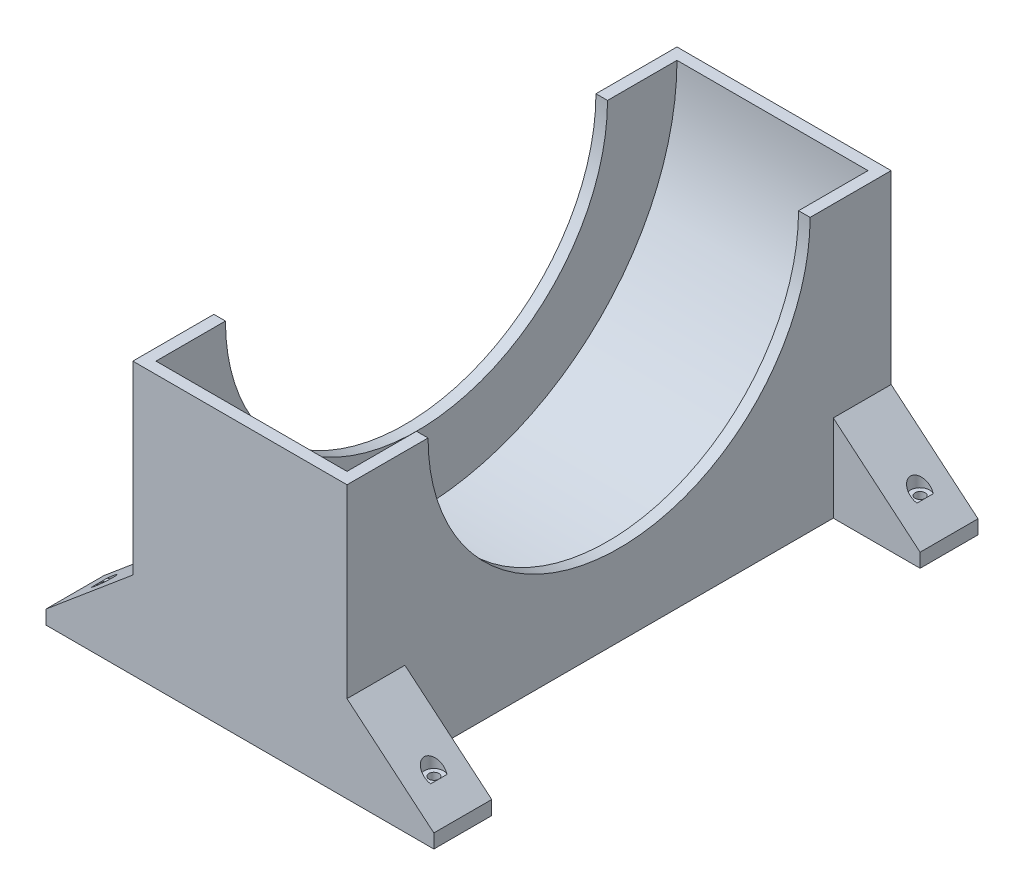
ISO-10303-21;
HEADER;
FILE_DESCRIPTION(('STEP AP214'),'2;1');
FILE_NAME('part.step','',(''),(''),'','','');
FILE_SCHEMA(('AUTOMOTIVE_DESIGN { 1 0 10303 214 1 1 1 1 }'));
ENDSEC;
DATA;
#1=APPLICATION_CONTEXT('core data for automotive mechanical design processes');
#2=APPLICATION_PROTOCOL_DEFINITION('international standard','automotive_design',2000,#1);
#3=PRODUCT_CONTEXT('',#1,'mechanical');
#4=PRODUCT('Part','Part','',(#3));
#5=PRODUCT_RELATED_PRODUCT_CATEGORY('part','',(#4));
#6=PRODUCT_DEFINITION_FORMATION('','',#4);
#7=PRODUCT_DEFINITION_CONTEXT('part definition',#1,'design');
#8=PRODUCT_DEFINITION('design','',#6,#7);
#9=PRODUCT_DEFINITION_SHAPE('','',#8);
#10=(LENGTH_UNIT() NAMED_UNIT(*) SI_UNIT(.MILLI.,.METRE.));
#11=(NAMED_UNIT(*) PLANE_ANGLE_UNIT() SI_UNIT($,.RADIAN.));
#12=(NAMED_UNIT(*) SI_UNIT($,.STERADIAN.) SOLID_ANGLE_UNIT());
#13=UNCERTAINTY_MEASURE_WITH_UNIT(LENGTH_MEASURE(1.E-05),#10,'distance_accuracy_value','');
#14=(GEOMETRIC_REPRESENTATION_CONTEXT(3) GLOBAL_UNCERTAINTY_ASSIGNED_CONTEXT((#13)) GLOBAL_UNIT_ASSIGNED_CONTEXT((#10,
#11,#12)) REPRESENTATION_CONTEXT('',''));
#15=CARTESIAN_POINT('',(0.,0.,0.));
#16=DIRECTION('',(0.,0.,1.));
#17=DIRECTION('',(1.,0.,0.));
#18=AXIS2_PLACEMENT_3D('',#15,#16,#17);
#19=CARTESIAN_POINT('',(119.38,0.,-106.68));
#20=DIRECTION('',(0.,-1.,0.));
#21=DIRECTION('',(0.,0.,-1.));
#22=AXIS2_PLACEMENT_3D('',#19,#20,#21);
#23=CYLINDRICAL_SURFACE('',#22,2.1828125);
#24=CARTESIAN_POINT('',(119.38,-119.38,-106.68));
#25=DIRECTION('',(0.,1.,0.));
#26=DIRECTION('',(0.,0.,1.));
#27=AXIS2_PLACEMENT_3D('',#24,#25,#26);
#28=CIRCLE('',#27,2.1828125);
#29=CARTESIAN_POINT('',(119.38,-119.38,-104.4971875));
#30=VERTEX_POINT('',#29);
#31=EDGE_CURVE('E265',#30,#30,#28,.T.);
#32=ORIENTED_EDGE('',*,*,#31,.F.);
#33=EDGE_LOOP('',(#32));
#34=FACE_BOUND('',#33,.T.);
#35=CARTESIAN_POINT('',(119.38,-104.424734,-106.68));
#36=DIRECTION('',(0.,1.,0.));
#37=DIRECTION('',(0.,0.,1.));
#38=AXIS2_PLACEMENT_3D('',#35,#36,#37);
#39=CIRCLE('',#38,2.1828125);
#40=CARTESIAN_POINT('',(121.5628125,-104.424730897791,-106.68));
#41=VERTEX_POINT('',#40);
#42=EDGE_CURVE('E451',#41,#41,#39,.T.);
#43=ORIENTED_EDGE('',*,*,#42,.T.);
#44=EDGE_LOOP('',(#43));
#45=FACE_BOUND('',#44,.T.);
#46=ADVANCED_FACE('F51',(#34,#45),#23,.F.);
#47=CARTESIAN_POINT('',(119.38,0.,106.68));
#48=DIRECTION('',(0.,-1.,0.));
#49=DIRECTION('',(0.,0.,-1.));
#50=AXIS2_PLACEMENT_3D('',#47,#48,#49);
#51=CYLINDRICAL_SURFACE('',#50,2.1828125);
#52=CARTESIAN_POINT('',(119.38,-119.38,106.68));
#53=DIRECTION('',(0.,1.,0.));
#54=DIRECTION('',(0.,0.,1.));
#55=AXIS2_PLACEMENT_3D('',#52,#53,#54);
#56=CIRCLE('',#55,2.1828125);
#57=CARTESIAN_POINT('',(119.38,-119.38,108.8628125));
#58=VERTEX_POINT('',#57);
#59=EDGE_CURVE('E269',#58,#58,#56,.F.);
#60=ORIENTED_EDGE('',*,*,#59,.T.);
#61=EDGE_LOOP('',(#60));
#62=FACE_BOUND('',#61,.T.);
#63=CARTESIAN_POINT('',(119.38,-104.424734,106.68));
#64=DIRECTION('',(0.,1.,0.));
#65=DIRECTION('',(0.,0.,1.));
#66=AXIS2_PLACEMENT_3D('',#63,#64,#65);
#67=CIRCLE('',#66,2.1828125);
#68=CARTESIAN_POINT('',(121.5628125,-104.424730897791,106.68));
#69=VERTEX_POINT('',#68);
#70=EDGE_CURVE('E449',#69,#69,#67,.F.);
#71=ORIENTED_EDGE('',*,*,#70,.F.);
#72=EDGE_LOOP('',(#71));
#73=FACE_BOUND('',#72,.T.);
#74=ADVANCED_FACE('F472',(#62,#73),#51,.F.);
#75=CARTESIAN_POINT('',(-25.4,0.,-106.68));
#76=DIRECTION('',(0.,-1.,0.));
#77=DIRECTION('',(0.,0.,-1.));
#78=AXIS2_PLACEMENT_3D('',#75,#76,#77);
#79=CYLINDRICAL_SURFACE('',#78,2.18281250000001);
#80=CARTESIAN_POINT('',(-25.4,-119.38,-106.68));
#81=DIRECTION('',(0.,1.,0.));
#82=DIRECTION('',(0.,0.,1.));
#83=AXIS2_PLACEMENT_3D('',#80,#81,#82);
#84=CIRCLE('',#83,2.18281250000001);
#85=CARTESIAN_POINT('',(-25.4,-119.38,-104.4971875));
#86=VERTEX_POINT('',#85);
#87=EDGE_CURVE('E268',#86,#86,#84,.F.);
#88=ORIENTED_EDGE('',*,*,#87,.T.);
#89=EDGE_LOOP('',(#88));
#90=FACE_BOUND('',#89,.T.);
#91=CARTESIAN_POINT('',(-25.4,-104.424734,-106.68));
#92=DIRECTION('',(0.,1.,0.));
#93=DIRECTION('',(0.,0.,1.));
#94=AXIS2_PLACEMENT_3D('',#91,#92,#93);
#95=CIRCLE('',#94,2.18281250000001);
#96=CARTESIAN_POINT('',(-27.5828125,-104.424730897791,-106.68));
#97=VERTEX_POINT('',#96);
#98=EDGE_CURVE('E447',#97,#97,#95,.F.);
#99=ORIENTED_EDGE('',*,*,#98,.F.);
#100=EDGE_LOOP('',(#99));
#101=FACE_BOUND('',#100,.T.);
#102=ADVANCED_FACE('F469',(#90,#101),#79,.F.);
#103=CARTESIAN_POINT('',(-25.4,0.,106.68));
#104=DIRECTION('',(0.,-1.,0.));
#105=DIRECTION('',(0.,0.,-1.));
#106=AXIS2_PLACEMENT_3D('',#103,#104,#105);
#107=CYLINDRICAL_SURFACE('',#106,2.18281250000001);
#108=CARTESIAN_POINT('',(-25.4,-119.38,106.68));
#109=DIRECTION('',(0.,1.,0.));
#110=DIRECTION('',(0.,0.,1.));
#111=AXIS2_PLACEMENT_3D('',#108,#109,#110);
#112=CIRCLE('',#111,2.18281250000001);
#113=CARTESIAN_POINT('',(-25.4,-119.38,108.8628125));
#114=VERTEX_POINT('',#113);
#115=EDGE_CURVE('E272',#114,#114,#112,.T.);
#116=ORIENTED_EDGE('',*,*,#115,.F.);
#117=EDGE_LOOP('',(#116));
#118=FACE_BOUND('',#117,.T.);
#119=CARTESIAN_POINT('',(-25.4,-104.424734,106.68));
#120=DIRECTION('',(0.,1.,0.));
#121=DIRECTION('',(0.,0.,1.));
#122=AXIS2_PLACEMENT_3D('',#119,#120,#121);
#123=CIRCLE('',#122,2.18281250000001);
#124=CARTESIAN_POINT('',(-27.5828125,-104.424730897791,106.68));
#125=VERTEX_POINT('',#124);
#126=EDGE_CURVE('E239',#125,#125,#123,.T.);
#127=ORIENTED_EDGE('',*,*,#126,.T.);
#128=EDGE_LOOP('',(#127));
#129=FACE_BOUND('',#128,.T.);
#130=ADVANCED_FACE('F471',(#118,#129),#107,.F.);
#131=CARTESIAN_POINT('',(93.98,-119.38,119.38));
#132=DIRECTION('',(0.,1.,0.));
#133=DIRECTION('',(0.,0.,1.));
#134=AXIS2_PLACEMENT_3D('',#131,#132,#133);
#135=PLANE('',#134);
#136=ORIENTED_EDGE('',*,*,#87,.F.);
#137=EDGE_LOOP('',(#136));
#138=FACE_BOUND('',#137,.T.);
#139=ORIENTED_EDGE('',*,*,#31,.T.);
#140=EDGE_LOOP('',(#139));
#141=FACE_BOUND('',#140,.T.);
#142=ORIENTED_EDGE('',*,*,#115,.T.);
#143=EDGE_LOOP('',(#142));
#144=FACE_BOUND('',#143,.T.);
#145=ORIENTED_EDGE('',*,*,#59,.F.);
#146=EDGE_LOOP('',(#145));
#147=FACE_BOUND('',#146,.T.);
#148=DIRECTION('',(-1.,0.,0.));
#149=VECTOR('',#148,1.);
#150=CARTESIAN_POINT('',(93.98,-119.38,119.38));
#151=LINE('',#150,#149);
#152=CARTESIAN_POINT('',(132.08,-119.38,119.38));
#153=VERTEX_POINT('',#152);
#154=CARTESIAN_POINT('',(-38.1,-119.38,119.38));
#155=VERTEX_POINT('',#154);
#156=EDGE_CURVE('E360',#153,#155,#151,.T.);
#157=ORIENTED_EDGE('',*,*,#156,.T.);
#158=DIRECTION('',(0.,0.,1.));
#159=VECTOR('',#158,1.);
#160=CARTESIAN_POINT('',(-38.1,-119.38,119.38));
#161=LINE('',#160,#159);
#162=CARTESIAN_POINT('',(-38.1,-119.38,93.98));
#163=VERTEX_POINT('',#162);
#164=EDGE_CURVE('E332',#163,#155,#161,.T.);
#165=ORIENTED_EDGE('',*,*,#164,.F.);
#166=DIRECTION('',(1.,0.,0.));
#167=VECTOR('',#166,1.);
#168=CARTESIAN_POINT('',(-38.1,-119.38,93.98));
#169=LINE('',#168,#167);
#170=CARTESIAN_POINT('',(0.,-119.38,93.98));
#171=VERTEX_POINT('',#170);
#172=EDGE_CURVE('E296',#163,#171,#169,.T.);
#173=ORIENTED_EDGE('',*,*,#172,.T.);
#174=DIRECTION('',(0.,0.,-1.));
#175=VECTOR('',#174,1.);
#176=CARTESIAN_POINT('',(0.,-119.38,119.38));
#177=LINE('',#176,#175);
#178=CARTESIAN_POINT('',(0.,-119.38,-93.9799999999999));
#179=VERTEX_POINT('',#178);
#180=EDGE_CURVE('E357',#171,#179,#177,.T.);
#181=ORIENTED_EDGE('',*,*,#180,.T.);
#182=DIRECTION('',(1.,0.,0.));
#183=VECTOR('',#182,1.);
#184=CARTESIAN_POINT('',(-38.1,-119.38,-93.98));
#185=LINE('',#184,#183);
#186=CARTESIAN_POINT('',(-38.1,-119.38,-93.98));
#187=VERTEX_POINT('',#186);
#188=EDGE_CURVE('E320',#187,#179,#185,.T.);
#189=ORIENTED_EDGE('',*,*,#188,.F.);
#190=DIRECTION('',(0.,0.,1.));
#191=VECTOR('',#190,1.);
#192=CARTESIAN_POINT('',(-38.1,-119.38,-119.38));
#193=LINE('',#192,#191);
#194=CARTESIAN_POINT('',(-38.1,-119.38,-119.38));
#195=VERTEX_POINT('',#194);
#196=EDGE_CURVE('E314',#195,#187,#193,.T.);
#197=ORIENTED_EDGE('',*,*,#196,.F.);
#198=DIRECTION('',(-1.,0.,0.));
#199=VECTOR('',#198,1.);
#200=CARTESIAN_POINT('',(93.98,-119.38,-119.38));
#201=LINE('',#200,#199);
#202=CARTESIAN_POINT('',(132.08,-119.38,-119.38));
#203=VERTEX_POINT('',#202);
#204=EDGE_CURVE('E348',#203,#195,#201,.T.);
#205=ORIENTED_EDGE('',*,*,#204,.F.);
#206=DIRECTION('',(0.,0.,1.));
#207=VECTOR('',#206,1.);
#208=CARTESIAN_POINT('',(132.08,-119.38,-119.38));
#209=LINE('',#208,#207);
#210=CARTESIAN_POINT('',(132.08,-119.38,-93.98));
#211=VERTEX_POINT('',#210);
#212=EDGE_CURVE('E285',#203,#211,#209,.T.);
#213=ORIENTED_EDGE('',*,*,#212,.T.);
#214=DIRECTION('',(-1.,0.,0.));
#215=VECTOR('',#214,1.);
#216=CARTESIAN_POINT('',(132.08,-119.38,-93.98));
#217=LINE('',#216,#215);
#218=CARTESIAN_POINT('',(93.98,-119.38,-93.98));
#219=VERTEX_POINT('',#218);
#220=EDGE_CURVE('E288',#211,#219,#217,.T.);
#221=ORIENTED_EDGE('',*,*,#220,.T.);
#222=DIRECTION('',(0.,0.,-1.));
#223=VECTOR('',#222,1.);
#224=CARTESIAN_POINT('',(93.98,-119.38,119.38));
#225=LINE('',#224,#223);
#226=CARTESIAN_POINT('',(93.98,-119.38,93.98));
#227=VERTEX_POINT('',#226);
#228=EDGE_CURVE('E356',#227,#219,#225,.T.);
#229=ORIENTED_EDGE('',*,*,#228,.F.);
#230=DIRECTION('',(-1.,0.,0.));
#231=VECTOR('',#230,1.);
#232=CARTESIAN_POINT('',(132.08,-119.38,93.98));
#233=LINE('',#232,#231);
#234=CARTESIAN_POINT('',(132.08,-119.38,93.98));
#235=VERTEX_POINT('',#234);
#236=EDGE_CURVE('E292',#235,#227,#233,.T.);
#237=ORIENTED_EDGE('',*,*,#236,.F.);
#238=DIRECTION('',(0.,0.,1.));
#239=VECTOR('',#238,1.);
#240=CARTESIAN_POINT('',(132.08,-119.38,119.38));
#241=LINE('',#240,#239);
#242=EDGE_CURVE('E300',#235,#153,#241,.T.);
#243=ORIENTED_EDGE('',*,*,#242,.T.);
#244=EDGE_LOOP('',(#157,#165,#173,#181,#189,#197,#205,#213,#221,#229,#237,#243));
#245=FACE_BOUND('',#244,.T.);
#246=ADVANCED_FACE('F479',(#138,#141,#144,#147,#245),#135,.F.);
#247=CARTESIAN_POINT('',(93.98,0.,0.));
#248=DIRECTION('',(1.,0.,0.));
#249=DIRECTION('',(0.,0.,-1.));
#250=AXIS2_PLACEMENT_3D('',#247,#248,#249);
#251=PLANE('',#250);
#252=ORIENTED_EDGE('',*,*,#228,.T.);
#253=DIRECTION('',(0.,1.,0.));
#254=VECTOR('',#253,1.);
#255=CARTESIAN_POINT('',(93.98,-119.38,-93.98));
#256=LINE('',#255,#254);
#257=CARTESIAN_POINT('',(93.98,-81.28,-93.98));
#258=VERTEX_POINT('',#257);
#259=EDGE_CURVE('E282',#219,#258,#256,.T.);
#260=ORIENTED_EDGE('',*,*,#259,.T.);
#261=DIRECTION('',(0.,0.,-1.));
#262=VECTOR('',#261,1.);
#263=CARTESIAN_POINT('',(93.98,-81.28,-119.38));
#264=LINE('',#263,#262);
#265=CARTESIAN_POINT('',(93.98,-81.28,-119.38));
#266=VERTEX_POINT('',#265);
#267=EDGE_CURVE('E289',#258,#266,#264,.T.);
#268=ORIENTED_EDGE('',*,*,#267,.T.);
#269=DIRECTION('',(0.,-1.,0.));
#270=VECTOR('',#269,1.);
#271=CARTESIAN_POINT('',(93.98,0.,-119.38));
#272=LINE('',#271,#270);
#273=CARTESIAN_POINT('',(93.98,0.,-119.38));
#274=VERTEX_POINT('',#273);
#275=EDGE_CURVE('E345',#274,#266,#272,.T.);
#276=ORIENTED_EDGE('',*,*,#275,.F.);
#277=DIRECTION('',(0.,0.,1.));
#278=VECTOR('',#277,1.);
#279=CARTESIAN_POINT('',(93.98,0.,-83.82));
#280=LINE('',#279,#278);
#281=CARTESIAN_POINT('',(93.98,0.,-83.82));
#282=VERTEX_POINT('',#281);
#283=EDGE_CURVE('E393',#274,#282,#280,.T.);
#284=ORIENTED_EDGE('',*,*,#283,.T.);
#285=CARTESIAN_POINT('',(93.98,0.,0.));
#286=DIRECTION('',(-1.,0.,0.));
#287=DIRECTION('',(0.,0.,-1.));
#288=AXIS2_PLACEMENT_3D('',#285,#286,#287);
#289=CIRCLE('',#288,83.82);
#290=CARTESIAN_POINT('',(93.98,0.,83.82));
#291=VERTEX_POINT('',#290);
#292=EDGE_CURVE('E395',#282,#291,#289,.T.);
#293=ORIENTED_EDGE('',*,*,#292,.T.);
#294=DIRECTION('',(0.,0.,1.));
#295=VECTOR('',#294,1.);
#296=CARTESIAN_POINT('',(93.98,0.,119.38));
#297=LINE('',#296,#295);
#298=CARTESIAN_POINT('',(93.98,0.,119.38));
#299=VERTEX_POINT('',#298);
#300=EDGE_CURVE('E398',#291,#299,#297,.T.);
#301=ORIENTED_EDGE('',*,*,#300,.T.);
#302=DIRECTION('',(0.,-1.,0.));
#303=VECTOR('',#302,1.);
#304=CARTESIAN_POINT('',(93.98,0.,119.38));
#305=LINE('',#304,#303);
#306=CARTESIAN_POINT('',(93.98,-81.28,119.38));
#307=VERTEX_POINT('',#306);
#308=EDGE_CURVE('E353',#299,#307,#305,.T.);
#309=ORIENTED_EDGE('',*,*,#308,.T.);
#310=DIRECTION('',(0.,0.,-1.));
#311=VECTOR('',#310,1.);
#312=CARTESIAN_POINT('',(93.98,-81.28,119.38));
#313=LINE('',#312,#311);
#314=CARTESIAN_POINT('',(93.98,-81.28,93.98));
#315=VERTEX_POINT('',#314);
#316=EDGE_CURVE('E301',#307,#315,#313,.T.);
#317=ORIENTED_EDGE('',*,*,#316,.T.);
#318=DIRECTION('',(0.,-1.,0.));
#319=VECTOR('',#318,1.);
#320=CARTESIAN_POINT('',(93.98,-119.38,93.98));
#321=LINE('',#320,#319);
#322=EDGE_CURVE('E277',#315,#227,#321,.T.);
#323=ORIENTED_EDGE('',*,*,#322,.T.);
#324=EDGE_LOOP('',(#252,#260,#268,#276,#284,#293,#301,#309,#317,#323));
#325=FACE_BOUND('',#324,.T.);
#326=ADVANCED_FACE('F545',(#325),#251,.T.);
#327=CARTESIAN_POINT('',(0.,0.,0.));
#328=DIRECTION('',(1.,0.,0.));
#329=DIRECTION('',(0.,0.,-1.));
#330=AXIS2_PLACEMENT_3D('',#327,#328,#329);
#331=PLANE('',#330);
#332=DIRECTION('',(0.,0.,-1.));
#333=VECTOR('',#332,1.);
#334=CARTESIAN_POINT('',(0.,-81.28,-119.38));
#335=LINE('',#334,#333);
#336=CARTESIAN_POINT('',(0.,-81.28,-93.98));
#337=VERTEX_POINT('',#336);
#338=CARTESIAN_POINT('',(0.,-81.28,-119.38));
#339=VERTEX_POINT('',#338);
#340=EDGE_CURVE('E315',#337,#339,#335,.T.);
#341=ORIENTED_EDGE('',*,*,#340,.F.);
#342=DIRECTION('',(0.,1.,0.));
#343=VECTOR('',#342,1.);
#344=CARTESIAN_POINT('',(0.,-119.38,-93.98));
#345=LINE('',#344,#343);
#346=EDGE_CURVE('E321',#179,#337,#345,.T.);
#347=ORIENTED_EDGE('',*,*,#346,.F.);
#348=ORIENTED_EDGE('',*,*,#180,.F.);
#349=DIRECTION('',(0.,-1.,0.));
#350=VECTOR('',#349,1.);
#351=CARTESIAN_POINT('',(0.,-119.38,93.98));
#352=LINE('',#351,#350);
#353=CARTESIAN_POINT('',(0.,-81.28,93.98));
#354=VERTEX_POINT('',#353);
#355=EDGE_CURVE('E333',#354,#171,#352,.T.);
#356=ORIENTED_EDGE('',*,*,#355,.F.);
#357=DIRECTION('',(0.,0.,-1.));
#358=VECTOR('',#357,1.);
#359=CARTESIAN_POINT('',(0.,-81.28,119.38));
#360=LINE('',#359,#358);
#361=CARTESIAN_POINT('',(0.,-81.28,119.38));
#362=VERTEX_POINT('',#361);
#363=EDGE_CURVE('E324',#362,#354,#360,.T.);
#364=ORIENTED_EDGE('',*,*,#363,.F.);
#365=DIRECTION('',(0.,-1.,0.));
#366=VECTOR('',#365,1.);
#367=CARTESIAN_POINT('',(0.,0.,119.38));
#368=LINE('',#367,#366);
#369=CARTESIAN_POINT('',(0.,0.,119.38));
#370=VERTEX_POINT('',#369);
#371=EDGE_CURVE('E352',#370,#362,#368,.T.);
#372=ORIENTED_EDGE('',*,*,#371,.F.);
#373=DIRECTION('',(0.,0.,1.));
#374=VECTOR('',#373,1.);
#375=CARTESIAN_POINT('',(0.,0.,119.38));
#376=LINE('',#375,#374);
#377=CARTESIAN_POINT('',(0.,0.,83.82));
#378=VERTEX_POINT('',#377);
#379=EDGE_CURVE('E396',#378,#370,#376,.T.);
#380=ORIENTED_EDGE('',*,*,#379,.F.);
#381=CARTESIAN_POINT('',(0.,0.,0.));
#382=DIRECTION('',(-1.,0.,0.));
#383=DIRECTION('',(0.,0.,-1.));
#384=AXIS2_PLACEMENT_3D('',#381,#382,#383);
#385=CIRCLE('',#384,83.82);
#386=CARTESIAN_POINT('',(0.,0.,-83.82));
#387=VERTEX_POINT('',#386);
#388=EDGE_CURVE('E403',#387,#378,#385,.T.);
#389=ORIENTED_EDGE('',*,*,#388,.F.);
#390=DIRECTION('',(0.,0.,1.));
#391=VECTOR('',#390,1.);
#392=CARTESIAN_POINT('',(0.,0.,-83.82));
#393=LINE('',#392,#391);
#394=CARTESIAN_POINT('',(0.,0.,-119.38));
#395=VERTEX_POINT('',#394);
#396=EDGE_CURVE('E377',#395,#387,#393,.T.);
#397=ORIENTED_EDGE('',*,*,#396,.F.);
#398=DIRECTION('',(0.,-1.,0.));
#399=VECTOR('',#398,1.);
#400=CARTESIAN_POINT('',(0.,0.,-119.38));
#401=LINE('',#400,#399);
#402=EDGE_CURVE('E329',#395,#339,#401,.T.);
#403=ORIENTED_EDGE('',*,*,#402,.T.);
#404=EDGE_LOOP('',(#341,#347,#348,#356,#364,#372,#380,#389,#397,#403));
#405=FACE_BOUND('',#404,.T.);
#406=ADVANCED_FACE('F609',(#405),#331,.F.);
#407=CARTESIAN_POINT('',(93.98,0.,-119.38));
#408=DIRECTION('',(0.,0.,-1.));
#409=DIRECTION('',(-1.,0.,0.));
#410=AXIS2_PLACEMENT_3D('',#407,#408,#409);
#411=PLANE('',#410);
#412=DIRECTION('',(0.,-1.,0.));
#413=VECTOR('',#412,1.);
#414=CARTESIAN_POINT('',(132.08,-119.38,-119.38));
#415=LINE('',#414,#413);
#416=CARTESIAN_POINT('',(132.08,-113.249695947854,-119.38));
#417=VERTEX_POINT('',#416);
#418=EDGE_CURVE('E278',#417,#203,#415,.T.);
#419=ORIENTED_EDGE('',*,*,#418,.T.);
#420=ORIENTED_EDGE('',*,*,#204,.T.);
#421=DIRECTION('',(0.,-1.,0.));
#422=VECTOR('',#421,1.);
#423=CARTESIAN_POINT('',(-38.1,-119.38,-119.38));
#424=LINE('',#423,#422);
#425=CARTESIAN_POINT('',(-38.1,-113.249695947854,-119.38));
#426=VERTEX_POINT('',#425);
#427=EDGE_CURVE('E311',#426,#195,#424,.T.);
#428=ORIENTED_EDGE('',*,*,#427,.F.);
#429=DIRECTION('',(-0.76604444311898,-0.642787609686537,0.));
#430=VECTOR('',#429,1.);
#431=CARTESIAN_POINT('',(95.1723149509855,-1.42094562634073,-119.38));
#432=LINE('',#431,#430);
#433=EDGE_CURVE('E430',#426,#339,#432,.F.);
#434=ORIENTED_EDGE('',*,*,#433,.T.);
#435=ORIENTED_EDGE('',*,*,#402,.F.);
#436=DIRECTION('',(-1.,0.,0.));
#437=VECTOR('',#436,1.);
#438=CARTESIAN_POINT('',(93.98,0.,-119.38));
#439=LINE('',#438,#437);
#440=EDGE_CURVE('E417',#274,#395,#439,.T.);
#441=ORIENTED_EDGE('',*,*,#440,.F.);
#442=ORIENTED_EDGE('',*,*,#275,.T.);
#443=DIRECTION('',(0.766044443118979,-0.642787609686538,0.));
#444=VECTOR('',#443,1.);
#445=CARTESIAN_POINT('',(53.9574129175838,-47.6970619403843,-119.38));
#446=LINE('',#445,#444);
#447=EDGE_CURVE('E440',#266,#417,#446,.T.);
#448=ORIENTED_EDGE('',*,*,#447,.T.);
#449=EDGE_LOOP('',(#419,#420,#428,#434,#435,#441,#442,#448));
#450=FACE_BOUND('',#449,.T.);
#451=ADVANCED_FACE('F557',(#450),#411,.T.);
#452=CARTESIAN_POINT('',(93.98,0.,119.38));
#453=DIRECTION('',(0.,0.,-1.));
#454=DIRECTION('',(-1.,0.,0.));
#455=AXIS2_PLACEMENT_3D('',#452,#453,#454);
#456=PLANE('',#455);
#457=ORIENTED_EDGE('',*,*,#371,.T.);
#458=DIRECTION('',(-0.76604444311898,-0.642787609686537,0.));
#459=VECTOR('',#458,1.);
#460=CARTESIAN_POINT('',(-38.1,-113.249695947854,119.38));
#461=LINE('',#460,#459);
#462=CARTESIAN_POINT('',(-38.1,-113.249695947854,119.38));
#463=VERTEX_POINT('',#462);
#464=EDGE_CURVE('E425',#362,#463,#461,.T.);
#465=ORIENTED_EDGE('',*,*,#464,.T.);
#466=DIRECTION('',(0.,1.,0.));
#467=VECTOR('',#466,1.);
#468=CARTESIAN_POINT('',(-38.1,-119.38,119.38));
#469=LINE('',#468,#467);
#470=EDGE_CURVE('E336',#155,#463,#469,.T.);
#471=ORIENTED_EDGE('',*,*,#470,.F.);
#472=ORIENTED_EDGE('',*,*,#156,.F.);
#473=DIRECTION('',(0.,1.,0.));
#474=VECTOR('',#473,1.);
#475=CARTESIAN_POINT('',(132.08,-119.38,119.38));
#476=LINE('',#475,#474);
#477=CARTESIAN_POINT('',(132.08,-113.249695947854,119.38));
#478=VERTEX_POINT('',#477);
#479=EDGE_CURVE('E297',#153,#478,#476,.T.);
#480=ORIENTED_EDGE('',*,*,#479,.T.);
#481=DIRECTION('',(0.766044443118979,-0.642787609686538,0.));
#482=VECTOR('',#481,1.);
#483=CARTESIAN_POINT('',(93.9799999999999,-81.28,119.38));
#484=LINE('',#483,#482);
#485=EDGE_CURVE('E438',#478,#307,#484,.F.);
#486=ORIENTED_EDGE('',*,*,#485,.T.);
#487=ORIENTED_EDGE('',*,*,#308,.F.);
#488=DIRECTION('',(-1.,0.,0.));
#489=VECTOR('',#488,1.);
#490=CARTESIAN_POINT('',(93.98,0.,119.38));
#491=LINE('',#490,#489);
#492=EDGE_CURVE('E400',#299,#370,#491,.T.);
#493=ORIENTED_EDGE('',*,*,#492,.T.);
#494=EDGE_LOOP('',(#457,#465,#471,#472,#480,#486,#487,#493));
#495=FACE_BOUND('',#494,.T.);
#496=ADVANCED_FACE('F593',(#495),#456,.F.);
#497=CARTESIAN_POINT('',(93.98,0.,-83.82));
#498=DIRECTION('',(0.,-1.,0.));
#499=DIRECTION('',(0.,0.,-1.));
#500=AXIS2_PLACEMENT_3D('',#497,#498,#499);
#501=PLANE('',#500);
#502=DIRECTION('',(0.,0.,1.));
#503=VECTOR('',#502,1.);
#504=CARTESIAN_POINT('',(5.08,0.,-83.82));
#505=LINE('',#504,#503);
#506=CARTESIAN_POINT('',(5.08,0.,-114.3));
#507=VERTEX_POINT('',#506);
#508=CARTESIAN_POINT('',(5.08,0.,-83.82));
#509=VERTEX_POINT('',#508);
#510=EDGE_CURVE('E369',#507,#509,#505,.T.);
#511=ORIENTED_EDGE('',*,*,#510,.F.);
#512=DIRECTION('',(-1.,0.,0.));
#513=VECTOR('',#512,1.);
#514=CARTESIAN_POINT('',(88.9,0.,-114.3));
#515=LINE('',#514,#513);
#516=CARTESIAN_POINT('',(88.9,0.,-114.3));
#517=VERTEX_POINT('',#516);
#518=EDGE_CURVE('E375',#517,#507,#515,.T.);
#519=ORIENTED_EDGE('',*,*,#518,.F.);
#520=DIRECTION('',(0.,0.,1.));
#521=VECTOR('',#520,1.);
#522=CARTESIAN_POINT('',(88.9,0.,-83.82));
#523=LINE('',#522,#521);
#524=CARTESIAN_POINT('',(88.9,0.,-83.82));
#525=VERTEX_POINT('',#524);
#526=EDGE_CURVE('E373',#517,#525,#523,.T.);
#527=ORIENTED_EDGE('',*,*,#526,.T.);
#528=DIRECTION('',(-1.,0.,0.));
#529=VECTOR('',#528,1.);
#530=CARTESIAN_POINT('',(93.98,0.,-83.82));
#531=LINE('',#530,#529);
#532=EDGE_CURVE('E414',#282,#525,#531,.T.);
#533=ORIENTED_EDGE('',*,*,#532,.F.);
#534=ORIENTED_EDGE('',*,*,#283,.F.);
#535=ORIENTED_EDGE('',*,*,#440,.T.);
#536=ORIENTED_EDGE('',*,*,#396,.T.);
#537=EDGE_CURVE('E413',#509,#387,#531,.T.);
#538=ORIENTED_EDGE('',*,*,#537,.F.);
#539=EDGE_LOOP('',(#511,#519,#527,#533,#534,#535,#536,#538));
#540=FACE_BOUND('',#539,.T.);
#541=ADVANCED_FACE('F566',(#540),#501,.F.);
#542=CARTESIAN_POINT('',(93.98,0.,0.));
#543=DIRECTION('',(-1.,0.,0.));
#544=DIRECTION('',(0.,0.,1.));
#545=AXIS2_PLACEMENT_3D('',#542,#543,#544);
#546=CYLINDRICAL_SURFACE('',#545,83.82);
#547=CARTESIAN_POINT('',(5.08,0.,0.));
#548=DIRECTION('',(1.,0.,0.));
#549=DIRECTION('',(0.,0.,-1.));
#550=AXIS2_PLACEMENT_3D('',#547,#548,#549);
#551=CIRCLE('',#550,83.82);
#552=CARTESIAN_POINT('',(5.08,0.,83.82));
#553=VERTEX_POINT('',#552);
#554=EDGE_CURVE('E380',#509,#553,#551,.F.);
#555=ORIENTED_EDGE('',*,*,#554,.F.);
#556=ORIENTED_EDGE('',*,*,#537,.T.);
#557=ORIENTED_EDGE('',*,*,#388,.T.);
#558=DIRECTION('',(-1.,0.,0.));
#559=VECTOR('',#558,1.);
#560=CARTESIAN_POINT('',(93.98,0.,83.82));
#561=LINE('',#560,#559);
#562=EDGE_CURVE('E409',#553,#378,#561,.T.);
#563=ORIENTED_EDGE('',*,*,#562,.F.);
#564=EDGE_LOOP('',(#555,#556,#557,#563));
#565=FACE_BOUND('',#564,.T.);
#566=ADVANCED_FACE('F615',(#565),#546,.F.);
#567=CARTESIAN_POINT('',(93.98,0.,119.38));
#568=DIRECTION('',(0.,-1.,0.));
#569=DIRECTION('',(0.,0.,-1.));
#570=AXIS2_PLACEMENT_3D('',#567,#568,#569);
#571=PLANE('',#570);
#572=DIRECTION('',(0.,0.,1.));
#573=VECTOR('',#572,1.);
#574=CARTESIAN_POINT('',(5.08,0.,119.38));
#575=LINE('',#574,#573);
#576=CARTESIAN_POINT('',(5.08,0.,114.3));
#577=VERTEX_POINT('',#576);
#578=EDGE_CURVE('E374',#553,#577,#575,.T.);
#579=ORIENTED_EDGE('',*,*,#578,.F.);
#580=ORIENTED_EDGE('',*,*,#562,.T.);
#581=ORIENTED_EDGE('',*,*,#379,.T.);
#582=ORIENTED_EDGE('',*,*,#492,.F.);
#583=ORIENTED_EDGE('',*,*,#300,.F.);
#584=CARTESIAN_POINT('',(88.9,0.,83.82));
#585=VERTEX_POINT('',#584);
#586=EDGE_CURVE('E410',#291,#585,#561,.T.);
#587=ORIENTED_EDGE('',*,*,#586,.T.);
#588=DIRECTION('',(0.,0.,1.));
#589=VECTOR('',#588,1.);
#590=CARTESIAN_POINT('',(88.9,0.,119.38));
#591=LINE('',#590,#589);
#592=CARTESIAN_POINT('',(88.9,0.,114.3));
#593=VERTEX_POINT('',#592);
#594=EDGE_CURVE('E385',#585,#593,#591,.T.);
#595=ORIENTED_EDGE('',*,*,#594,.T.);
#596=DIRECTION('',(-1.,0.,0.));
#597=VECTOR('',#596,1.);
#598=CARTESIAN_POINT('',(88.9,0.,114.3));
#599=LINE('',#598,#597);
#600=EDGE_CURVE('E378',#593,#577,#599,.T.);
#601=ORIENTED_EDGE('',*,*,#600,.T.);
#602=EDGE_LOOP('',(#579,#580,#581,#582,#583,#587,#595,#601));
#603=FACE_BOUND('',#602,.T.);
#604=ADVANCED_FACE('F574',(#603),#571,.F.);
#605=ORIENTED_EDGE('',*,*,#532,.T.);
#606=CARTESIAN_POINT('',(88.9,0.,0.));
#607=DIRECTION('',(1.,0.,0.));
#608=DIRECTION('',(0.,0.,-1.));
#609=AXIS2_PLACEMENT_3D('',#606,#607,#608);
#610=CIRCLE('',#609,83.82);
#611=EDGE_CURVE('E388',#525,#585,#610,.F.);
#612=ORIENTED_EDGE('',*,*,#611,.T.);
#613=ORIENTED_EDGE('',*,*,#586,.F.);
#614=ORIENTED_EDGE('',*,*,#292,.F.);
#615=EDGE_LOOP('',(#605,#612,#613,#614));
#616=FACE_BOUND('',#615,.T.);
#617=ADVANCED_FACE('F569',(#616),#546,.F.);
#618=CARTESIAN_POINT('',(93.98,0.,0.));
#619=DIRECTION('',(-1.,0.,0.));
#620=DIRECTION('',(0.,0.,1.));
#621=AXIS2_PLACEMENT_3D('',#618,#619,#620);
#622=CYLINDRICAL_SURFACE('',#621,114.3);
#623=CARTESIAN_POINT('',(5.08,0.,0.));
#624=DIRECTION('',(1.,0.,0.));
#625=DIRECTION('',(0.,0.,-1.));
#626=AXIS2_PLACEMENT_3D('',#623,#624,#625);
#627=CIRCLE('',#626,114.3);
#628=EDGE_CURVE('E366',#577,#507,#627,.T.);
#629=ORIENTED_EDGE('',*,*,#628,.F.);
#630=ORIENTED_EDGE('',*,*,#600,.F.);
#631=CARTESIAN_POINT('',(88.9,0.,0.));
#632=DIRECTION('',(1.,0.,0.));
#633=DIRECTION('',(0.,0.,-1.));
#634=AXIS2_PLACEMENT_3D('',#631,#632,#633);
#635=CIRCLE('',#634,114.3);
#636=EDGE_CURVE('E370',#593,#517,#635,.T.);
#637=ORIENTED_EDGE('',*,*,#636,.T.);
#638=ORIENTED_EDGE('',*,*,#518,.T.);
#639=EDGE_LOOP('',(#629,#630,#637,#638));
#640=FACE_BOUND('',#639,.T.);
#641=ADVANCED_FACE('F622',(#640),#622,.F.);
#642=CARTESIAN_POINT('',(88.9,0.,0.));
#643=DIRECTION('',(1.,0.,0.));
#644=DIRECTION('',(0.,0.,-1.));
#645=AXIS2_PLACEMENT_3D('',#642,#643,#644);
#646=PLANE('',#645);
#647=ORIENTED_EDGE('',*,*,#636,.F.);
#648=ORIENTED_EDGE('',*,*,#594,.F.);
#649=ORIENTED_EDGE('',*,*,#611,.F.);
#650=ORIENTED_EDGE('',*,*,#526,.F.);
#651=EDGE_LOOP('',(#647,#648,#649,#650));
#652=FACE_BOUND('',#651,.T.);
#653=ADVANCED_FACE('F624',(#652),#646,.F.);
#654=CARTESIAN_POINT('',(5.08,0.,0.));
#655=DIRECTION('',(1.,0.,0.));
#656=DIRECTION('',(0.,0.,-1.));
#657=AXIS2_PLACEMENT_3D('',#654,#655,#656);
#658=PLANE('',#657);
#659=ORIENTED_EDGE('',*,*,#628,.T.);
#660=ORIENTED_EDGE('',*,*,#510,.T.);
#661=ORIENTED_EDGE('',*,*,#554,.T.);
#662=ORIENTED_EDGE('',*,*,#578,.T.);
#663=EDGE_LOOP('',(#659,#660,#661,#662));
#664=FACE_BOUND('',#663,.T.);
#665=ADVANCED_FACE('F618',(#664),#658,.T.);
#666=CARTESIAN_POINT('',(-38.1,-119.38,93.98));
#667=DIRECTION('',(0.,0.,1.));
#668=DIRECTION('',(1.,0.,0.));
#669=AXIS2_PLACEMENT_3D('',#666,#667,#668);
#670=PLANE('',#669);
#671=DIRECTION('',(0.,-1.,0.));
#672=VECTOR('',#671,1.);
#673=CARTESIAN_POINT('',(-38.1,-119.38,93.98));
#674=LINE('',#673,#672);
#675=CARTESIAN_POINT('',(-38.1,-113.249695947854,93.98));
#676=VERTEX_POINT('',#675);
#677=EDGE_CURVE('E341',#676,#163,#674,.T.);
#678=ORIENTED_EDGE('',*,*,#677,.F.);
#679=DIRECTION('',(0.76604444311898,0.642787609686537,0.));
#680=VECTOR('',#679,1.);
#681=CARTESIAN_POINT('',(-38.1,-113.249695947854,93.98));
#682=LINE('',#681,#680);
#683=EDGE_CURVE('E423',#676,#354,#682,.T.);
#684=ORIENTED_EDGE('',*,*,#683,.T.);
#685=ORIENTED_EDGE('',*,*,#355,.T.);
#686=ORIENTED_EDGE('',*,*,#172,.F.);
#687=EDGE_LOOP('',(#678,#684,#685,#686));
#688=FACE_BOUND('',#687,.T.);
#689=ADVANCED_FACE('F597',(#688),#670,.F.);
#690=CARTESIAN_POINT('',(-38.1,0.,0.));
#691=DIRECTION('',(-1.,0.,0.));
#692=DIRECTION('',(0.,0.,1.));
#693=AXIS2_PLACEMENT_3D('',#690,#691,#692);
#694=PLANE('',#693);
#695=ORIENTED_EDGE('',*,*,#470,.T.);
#696=DIRECTION('',(0.,0.,-1.));
#697=VECTOR('',#696,1.);
#698=CARTESIAN_POINT('',(-38.1,-113.249695947854,93.98));
#699=LINE('',#698,#697);
#700=EDGE_CURVE('E420',#463,#676,#699,.T.);
#701=ORIENTED_EDGE('',*,*,#700,.T.);
#702=ORIENTED_EDGE('',*,*,#677,.T.);
#703=ORIENTED_EDGE('',*,*,#164,.T.);
#704=EDGE_LOOP('',(#695,#701,#702,#703));
#705=FACE_BOUND('',#704,.T.);
#706=ADVANCED_FACE('F589',(#705),#694,.T.);
#707=CARTESIAN_POINT('',(-38.1,-119.38,-93.98));
#708=DIRECTION('',(0.,0.,-1.));
#709=DIRECTION('',(-1.,0.,0.));
#710=AXIS2_PLACEMENT_3D('',#707,#708,#709);
#711=PLANE('',#710);
#712=ORIENTED_EDGE('',*,*,#346,.T.);
#713=DIRECTION('',(0.76604444311898,0.642787609686537,0.));
#714=VECTOR('',#713,1.);
#715=CARTESIAN_POINT('',(-38.1,-113.249695947854,-93.98));
#716=LINE('',#715,#714);
#717=CARTESIAN_POINT('',(-38.1,-113.249695947854,-93.98));
#718=VERTEX_POINT('',#717);
#719=EDGE_CURVE('E432',#337,#718,#716,.F.);
#720=ORIENTED_EDGE('',*,*,#719,.T.);
#721=DIRECTION('',(0.,1.,0.));
#722=VECTOR('',#721,1.);
#723=CARTESIAN_POINT('',(-38.1,-119.38,-93.98));
#724=LINE('',#723,#722);
#725=EDGE_CURVE('E317',#187,#718,#724,.T.);
#726=ORIENTED_EDGE('',*,*,#725,.F.);
#727=ORIENTED_EDGE('',*,*,#188,.T.);
#728=EDGE_LOOP('',(#712,#720,#726,#727));
#729=FACE_BOUND('',#728,.T.);
#730=ADVANCED_FACE('F604',(#729),#711,.F.);
#731=CARTESIAN_POINT('',(-38.1,0.,0.));
#732=DIRECTION('',(1.,0.,0.));
#733=DIRECTION('',(0.,0.,-1.));
#734=AXIS2_PLACEMENT_3D('',#731,#732,#733);
#735=PLANE('',#734);
#736=ORIENTED_EDGE('',*,*,#725,.T.);
#737=DIRECTION('',(0.,0.,-1.));
#738=VECTOR('',#737,1.);
#739=CARTESIAN_POINT('',(-38.1,-113.249695947854,0.));
#740=LINE('',#739,#738);
#741=EDGE_CURVE('E427',#718,#426,#740,.T.);
#742=ORIENTED_EDGE('',*,*,#741,.T.);
#743=ORIENTED_EDGE('',*,*,#427,.T.);
#744=ORIENTED_EDGE('',*,*,#196,.T.);
#745=EDGE_LOOP('',(#736,#742,#743,#744));
#746=FACE_BOUND('',#745,.T.);
#747=ADVANCED_FACE('F608',(#746),#735,.F.);
#748=CARTESIAN_POINT('',(-38.1,-113.249695947854,0.));
#749=DIRECTION('',(-0.642787609686537,0.76604444311898,0.));
#750=DIRECTION('',(0.,0.,1.));
#751=AXIS2_PLACEMENT_3D('',#748,#749,#750);
#752=PLANE('',#751);
#753=CARTESIAN_POINT('',(-25.4,-102.593130631903,106.68));
#754=DIRECTION('',(-0.642787609686537,0.76604444311898,0.));
#755=DIRECTION('',(0.76604444311898,0.642787609686537,0.));
#756=AXIS2_PLACEMENT_3D('',#753,#754,#755);
#757=ELLIPSE('',#756,5.47096194959157,4.191);
#758=CARTESIAN_POINT('',(-27.5828198941374,-104.424734,110.257677781712));
#759=VERTEX_POINT('',#758);
#760=CARTESIAN_POINT('',(-27.5828198941374,-104.424734,103.102322218288));
#761=VERTEX_POINT('',#760);
#762=EDGE_CURVE('E12',#759,#761,#757,.T.);
#763=ORIENTED_EDGE('',*,*,#762,.F.);
#764=DIRECTION('',(0.,0.,-1.));
#765=VECTOR('',#764,1.);
#766=CARTESIAN_POINT('',(-27.5828198941374,-104.424734,0.));
#767=LINE('',#766,#765);
#768=EDGE_CURVE('E236',#759,#125,#767,.T.);
#769=ORIENTED_EDGE('',*,*,#768,.T.);
#770=EDGE_CURVE('E244',#125,#761,#767,.T.);
#771=ORIENTED_EDGE('',*,*,#770,.T.);
#772=EDGE_LOOP('',(#763,#769,#771));
#773=FACE_BOUND('',#772,.T.);
#774=ORIENTED_EDGE('',*,*,#464,.F.);
#775=ORIENTED_EDGE('',*,*,#363,.T.);
#776=ORIENTED_EDGE('',*,*,#683,.F.);
#777=ORIENTED_EDGE('',*,*,#700,.F.);
#778=EDGE_LOOP('',(#774,#775,#776,#777));
#779=FACE_BOUND('',#778,.T.);
#780=ADVANCED_FACE('F250',(#773,#779),#752,.T.);
#781=CARTESIAN_POINT('',(-38.1,-113.249695947854,0.));
#782=DIRECTION('',(0.642787609686537,-0.76604444311898,0.));
#783=DIRECTION('',(0.,0.,-1.));
#784=AXIS2_PLACEMENT_3D('',#781,#782,#783);
#785=PLANE('',#784);
#786=CARTESIAN_POINT('',(-25.4,-102.593130631903,-106.68));
#787=DIRECTION('',(0.642787609686537,-0.76604444311898,0.));
#788=DIRECTION('',(0.76604444311898,0.642787609686537,0.));
#789=AXIS2_PLACEMENT_3D('',#786,#787,#788);
#790=ELLIPSE('',#789,5.47096194959157,4.191);
#791=CARTESIAN_POINT('',(-27.5828198941374,-104.424734,-103.102322218288));
#792=VERTEX_POINT('',#791);
#793=CARTESIAN_POINT('',(-27.5828198941374,-104.424734,-110.257677781712));
#794=VERTEX_POINT('',#793);
#795=EDGE_CURVE('E60',#792,#794,#790,.F.);
#796=ORIENTED_EDGE('',*,*,#795,.F.);
#797=DIRECTION('',(0.,0.,1.));
#798=VECTOR('',#797,1.);
#799=CARTESIAN_POINT('',(-27.5828198941374,-104.424734,0.));
#800=LINE('',#799,#798);
#801=EDGE_CURVE('E256',#792,#97,#800,.F.);
#802=ORIENTED_EDGE('',*,*,#801,.T.);
#803=EDGE_CURVE('E243',#97,#794,#800,.F.);
#804=ORIENTED_EDGE('',*,*,#803,.T.);
#805=EDGE_LOOP('',(#796,#802,#804));
#806=FACE_BOUND('',#805,.T.);
#807=ORIENTED_EDGE('',*,*,#719,.F.);
#808=ORIENTED_EDGE('',*,*,#340,.T.);
#809=ORIENTED_EDGE('',*,*,#433,.F.);
#810=ORIENTED_EDGE('',*,*,#741,.F.);
#811=EDGE_LOOP('',(#807,#808,#809,#810));
#812=FACE_BOUND('',#811,.T.);
#813=ADVANCED_FACE('F464',(#806,#812),#785,.F.);
#814=CARTESIAN_POINT('',(132.08,-119.38,93.98));
#815=DIRECTION('',(0.,0.,-1.));
#816=DIRECTION('',(-1.,0.,0.));
#817=AXIS2_PLACEMENT_3D('',#814,#815,#816);
#818=PLANE('',#817);
#819=ORIENTED_EDGE('',*,*,#322,.F.);
#820=DIRECTION('',(-0.766044443118979,0.642787609686538,0.));
#821=VECTOR('',#820,1.);
#822=CARTESIAN_POINT('',(135.098585479438,-115.782589910328,93.98));
#823=LINE('',#822,#821);
#824=CARTESIAN_POINT('',(132.08,-113.249695947854,93.98));
#825=VERTEX_POINT('',#824);
#826=EDGE_CURVE('E434',#315,#825,#823,.F.);
#827=ORIENTED_EDGE('',*,*,#826,.T.);
#828=DIRECTION('',(0.,-1.,0.));
#829=VECTOR('',#828,1.);
#830=CARTESIAN_POINT('',(132.08,-119.38,93.98));
#831=LINE('',#830,#829);
#832=EDGE_CURVE('E304',#825,#235,#831,.T.);
#833=ORIENTED_EDGE('',*,*,#832,.T.);
#834=ORIENTED_EDGE('',*,*,#236,.T.);
#835=EDGE_LOOP('',(#819,#827,#833,#834));
#836=FACE_BOUND('',#835,.T.);
#837=ADVANCED_FACE('F582',(#836),#818,.T.);
#838=CARTESIAN_POINT('',(132.08,0.,0.));
#839=DIRECTION('',(1.,0.,0.));
#840=DIRECTION('',(0.,0.,1.));
#841=AXIS2_PLACEMENT_3D('',#838,#839,#840);
#842=PLANE('',#841);
#843=ORIENTED_EDGE('',*,*,#832,.F.);
#844=DIRECTION('',(0.,0.,1.));
#845=VECTOR('',#844,1.);
#846=CARTESIAN_POINT('',(132.08,-113.249695947854,0.));
#847=LINE('',#846,#845);
#848=EDGE_CURVE('E436',#825,#478,#847,.T.);
#849=ORIENTED_EDGE('',*,*,#848,.T.);
#850=ORIENTED_EDGE('',*,*,#479,.F.);
#851=ORIENTED_EDGE('',*,*,#242,.F.);
#852=EDGE_LOOP('',(#843,#849,#850,#851));
#853=FACE_BOUND('',#852,.T.);
#854=ADVANCED_FACE('F584',(#853),#842,.T.);
#855=CARTESIAN_POINT('',(132.08,-119.38,-93.98));
#856=DIRECTION('',(0.,0.,1.));
#857=DIRECTION('',(1.,0.,0.));
#858=AXIS2_PLACEMENT_3D('',#855,#856,#857);
#859=PLANE('',#858);
#860=DIRECTION('',(0.,1.,0.));
#861=VECTOR('',#860,1.);
#862=CARTESIAN_POINT('',(132.08,-119.38,-93.98));
#863=LINE('',#862,#861);
#864=CARTESIAN_POINT('',(132.08,-113.249695947854,-93.98));
#865=VERTEX_POINT('',#864);
#866=EDGE_CURVE('E281',#211,#865,#863,.T.);
#867=ORIENTED_EDGE('',*,*,#866,.T.);
#868=DIRECTION('',(-0.766044443118979,0.642787609686538,0.));
#869=VECTOR('',#868,1.);
#870=CARTESIAN_POINT('',(135.098585479438,-115.782589910328,-93.98));
#871=LINE('',#870,#869);
#872=EDGE_CURVE('E444',#865,#258,#871,.T.);
#873=ORIENTED_EDGE('',*,*,#872,.T.);
#874=ORIENTED_EDGE('',*,*,#259,.F.);
#875=ORIENTED_EDGE('',*,*,#220,.F.);
#876=EDGE_LOOP('',(#867,#873,#874,#875));
#877=FACE_BOUND('',#876,.T.);
#878=ADVANCED_FACE('F542',(#877),#859,.T.);
#879=CARTESIAN_POINT('',(132.08,0.,0.));
#880=DIRECTION('',(-1.,0.,0.));
#881=DIRECTION('',(0.,0.,-1.));
#882=AXIS2_PLACEMENT_3D('',#879,#880,#881);
#883=PLANE('',#882);
#884=ORIENTED_EDGE('',*,*,#418,.F.);
#885=DIRECTION('',(0.,0.,1.));
#886=VECTOR('',#885,1.);
#887=CARTESIAN_POINT('',(132.08,-113.249695947854,-93.98));
#888=LINE('',#887,#886);
#889=EDGE_CURVE('E442',#417,#865,#888,.T.);
#890=ORIENTED_EDGE('',*,*,#889,.T.);
#891=ORIENTED_EDGE('',*,*,#866,.F.);
#892=ORIENTED_EDGE('',*,*,#212,.F.);
#893=EDGE_LOOP('',(#884,#890,#891,#892));
#894=FACE_BOUND('',#893,.T.);
#895=ADVANCED_FACE('F555',(#894),#883,.F.);
#896=CARTESIAN_POINT('',(93.9799999999999,-81.28,119.38));
#897=DIRECTION('',(-0.642787609686538,-0.766044443118979,0.));
#898=DIRECTION('',(0.,0.,-1.));
#899=AXIS2_PLACEMENT_3D('',#896,#897,#898);
#900=PLANE('',#899);
#901=CARTESIAN_POINT('',(119.38,-102.593130631903,106.68));
#902=DIRECTION('',(-0.642787609686538,-0.766044443118979,0.));
#903=DIRECTION('',(-0.766044443118979,0.642787609686538,0.));
#904=AXIS2_PLACEMENT_3D('',#901,#902,#903);
#905=ELLIPSE('',#904,5.47096194959158,4.191);
#906=CARTESIAN_POINT('',(121.562819894137,-104.424734,103.102322218288));
#907=VERTEX_POINT('',#906);
#908=CARTESIAN_POINT('',(121.562819894137,-104.424734,110.257677781712));
#909=VERTEX_POINT('',#908);
#910=EDGE_CURVE('E457',#907,#909,#905,.F.);
#911=ORIENTED_EDGE('',*,*,#910,.F.);
#912=DIRECTION('',(0.,0.,-1.));
#913=VECTOR('',#912,1.);
#914=CARTESIAN_POINT('',(121.562819894137,-104.424734,119.38));
#915=LINE('',#914,#913);
#916=EDGE_CURVE('E260',#907,#69,#915,.F.);
#917=ORIENTED_EDGE('',*,*,#916,.T.);
#918=EDGE_CURVE('E257',#69,#909,#915,.F.);
#919=ORIENTED_EDGE('',*,*,#918,.T.);
#920=EDGE_LOOP('',(#911,#917,#919));
#921=FACE_BOUND('',#920,.T.);
#922=ORIENTED_EDGE('',*,*,#485,.F.);
#923=ORIENTED_EDGE('',*,*,#848,.F.);
#924=ORIENTED_EDGE('',*,*,#826,.F.);
#925=ORIENTED_EDGE('',*,*,#316,.F.);
#926=EDGE_LOOP('',(#922,#923,#924,#925));
#927=FACE_BOUND('',#926,.T.);
#928=ADVANCED_FACE('F523',(#921,#927),#900,.F.);
#929=CARTESIAN_POINT('',(93.9799999999999,-81.28,-119.38));
#930=DIRECTION('',(0.642787609686538,0.766044443118979,0.));
#931=DIRECTION('',(0.,0.,1.));
#932=AXIS2_PLACEMENT_3D('',#929,#930,#931);
#933=PLANE('',#932);
#934=CARTESIAN_POINT('',(119.38,-102.593130631903,-106.68));
#935=DIRECTION('',(0.642787609686538,0.766044443118979,0.));
#936=DIRECTION('',(-0.766044443118979,0.642787609686538,0.));
#937=AXIS2_PLACEMENT_3D('',#934,#935,#936);
#938=ELLIPSE('',#937,5.47096194959158,4.191);
#939=CARTESIAN_POINT('',(121.562819894137,-104.424734,-110.257677781712));
#940=VERTEX_POINT('',#939);
#941=CARTESIAN_POINT('',(121.562819894137,-104.424734,-103.102322218288));
#942=VERTEX_POINT('',#941);
#943=EDGE_CURVE('E454',#940,#942,#938,.T.);
#944=ORIENTED_EDGE('',*,*,#943,.F.);
#945=DIRECTION('',(0.,0.,1.));
#946=VECTOR('',#945,1.);
#947=CARTESIAN_POINT('',(121.562819894137,-104.424734,-119.38));
#948=LINE('',#947,#946);
#949=EDGE_CURVE('E264',#940,#41,#948,.T.);
#950=ORIENTED_EDGE('',*,*,#949,.T.);
#951=EDGE_CURVE('E261',#41,#942,#948,.T.);
#952=ORIENTED_EDGE('',*,*,#951,.T.);
#953=EDGE_LOOP('',(#944,#950,#952));
#954=FACE_BOUND('',#953,.T.);
#955=ORIENTED_EDGE('',*,*,#872,.F.);
#956=ORIENTED_EDGE('',*,*,#889,.F.);
#957=ORIENTED_EDGE('',*,*,#447,.F.);
#958=ORIENTED_EDGE('',*,*,#267,.F.);
#959=EDGE_LOOP('',(#955,#956,#957,#958));
#960=FACE_BOUND('',#959,.T.);
#961=ADVANCED_FACE('F54',(#954,#960),#933,.T.);
#962=CARTESIAN_POINT('',(-25.4,-104.424734,106.68));
#963=DIRECTION('',(0.,1.,0.));
#964=DIRECTION('',(0.,0.,1.));
#965=AXIS2_PLACEMENT_3D('',#962,#963,#964);
#966=CYLINDRICAL_SURFACE('',#965,4.191);
#967=ORIENTED_EDGE('',*,*,#762,.T.);
#968=CARTESIAN_POINT('',(-25.4,-104.424734,106.68));
#969=DIRECTION('',(0.,1.,0.));
#970=DIRECTION('',(0.,0.,1.));
#971=AXIS2_PLACEMENT_3D('',#968,#969,#970);
#972=CIRCLE('',#971,4.191);
#973=EDGE_CURVE('E67',#759,#761,#972,.T.);
#974=ORIENTED_EDGE('',*,*,#973,.F.);
#975=EDGE_LOOP('',(#967,#974));
#976=FACE_BOUND('',#975,.T.);
#977=ADVANCED_FACE('F247',(#976),#966,.F.);
#978=CARTESIAN_POINT('',(-25.4,-104.424734,106.68));
#979=DIRECTION('',(0.,1.,0.));
#980=DIRECTION('',(0.,0.,1.));
#981=AXIS2_PLACEMENT_3D('',#978,#979,#980);
#982=PLANE('',#981);
#983=ORIENTED_EDGE('',*,*,#973,.T.);
#984=ORIENTED_EDGE('',*,*,#770,.F.);
#985=ORIENTED_EDGE('',*,*,#126,.F.);
#986=ORIENTED_EDGE('',*,*,#768,.F.);
#987=EDGE_LOOP('',(#983,#984,#985,#986));
#988=FACE_BOUND('',#987,.T.);
#989=ADVANCED_FACE('F237',(#988),#982,.T.);
#990=CARTESIAN_POINT('',(-25.4,-104.424734,-106.68));
#991=DIRECTION('',(0.,1.,0.));
#992=DIRECTION('',(0.,0.,1.));
#993=AXIS2_PLACEMENT_3D('',#990,#991,#992);
#994=PLANE('',#993);
#995=CARTESIAN_POINT('',(-25.4,-104.424734,-106.68));
#996=DIRECTION('',(0.,1.,0.));
#997=DIRECTION('',(0.,0.,1.));
#998=AXIS2_PLACEMENT_3D('',#995,#996,#997);
#999=CIRCLE('',#998,4.191);
#1000=EDGE_CURVE('E74',#792,#794,#999,.T.);
#1001=ORIENTED_EDGE('',*,*,#1000,.T.);
#1002=ORIENTED_EDGE('',*,*,#803,.F.);
#1003=ORIENTED_EDGE('',*,*,#98,.T.);
#1004=ORIENTED_EDGE('',*,*,#801,.F.);
#1005=EDGE_LOOP('',(#1001,#1002,#1003,#1004));
#1006=FACE_BOUND('',#1005,.T.);
#1007=ADVANCED_FACE('F467',(#1006),#994,.T.);
#1008=CARTESIAN_POINT('',(-25.4,-104.424734,-106.68));
#1009=DIRECTION('',(0.,1.,0.));
#1010=DIRECTION('',(0.,0.,1.));
#1011=AXIS2_PLACEMENT_3D('',#1008,#1009,#1010);
#1012=CYLINDRICAL_SURFACE('',#1011,4.191);
#1013=ORIENTED_EDGE('',*,*,#795,.T.);
#1014=ORIENTED_EDGE('',*,*,#1000,.F.);
#1015=EDGE_LOOP('',(#1013,#1014));
#1016=FACE_BOUND('',#1015,.T.);
#1017=ADVANCED_FACE('F461',(#1016),#1012,.F.);
#1018=CARTESIAN_POINT('',(119.38,-104.424734,106.68));
#1019=DIRECTION('',(0.,1.,0.));
#1020=DIRECTION('',(0.,0.,1.));
#1021=AXIS2_PLACEMENT_3D('',#1018,#1019,#1020);
#1022=PLANE('',#1021);
#1023=CARTESIAN_POINT('',(119.38,-104.424734,106.68));
#1024=DIRECTION('',(0.,1.,0.));
#1025=DIRECTION('',(0.,0.,1.));
#1026=AXIS2_PLACEMENT_3D('',#1023,#1024,#1025);
#1027=CIRCLE('',#1026,4.191);
#1028=EDGE_CURVE('E248',#907,#909,#1027,.T.);
#1029=ORIENTED_EDGE('',*,*,#1028,.T.);
#1030=ORIENTED_EDGE('',*,*,#918,.F.);
#1031=ORIENTED_EDGE('',*,*,#70,.T.);
#1032=ORIENTED_EDGE('',*,*,#916,.F.);
#1033=EDGE_LOOP('',(#1029,#1030,#1031,#1032));
#1034=FACE_BOUND('',#1033,.T.);
#1035=ADVANCED_FACE('F501',(#1034),#1022,.T.);
#1036=CARTESIAN_POINT('',(119.38,-104.424734,106.68));
#1037=DIRECTION('',(0.,1.,0.));
#1038=DIRECTION('',(0.,0.,1.));
#1039=AXIS2_PLACEMENT_3D('',#1036,#1037,#1038);
#1040=CYLINDRICAL_SURFACE('',#1039,4.191);
#1041=ORIENTED_EDGE('',*,*,#910,.T.);
#1042=ORIENTED_EDGE('',*,*,#1028,.F.);
#1043=EDGE_LOOP('',(#1041,#1042));
#1044=FACE_BOUND('',#1043,.T.);
#1045=ADVANCED_FACE('F509',(#1044),#1040,.F.);
#1046=CARTESIAN_POINT('',(119.38,-104.424734,-106.68));
#1047=DIRECTION('',(0.,1.,0.));
#1048=DIRECTION('',(0.,0.,1.));
#1049=AXIS2_PLACEMENT_3D('',#1046,#1047,#1048);
#1050=CYLINDRICAL_SURFACE('',#1049,4.191);
#1051=ORIENTED_EDGE('',*,*,#943,.T.);
#1052=CARTESIAN_POINT('',(119.38,-104.424734,-106.68));
#1053=DIRECTION('',(0.,1.,0.));
#1054=DIRECTION('',(0.,0.,1.));
#1055=AXIS2_PLACEMENT_3D('',#1052,#1053,#1054);
#1056=CIRCLE('',#1055,4.191);
#1057=EDGE_CURVE('E527',#940,#942,#1056,.T.);
#1058=ORIENTED_EDGE('',*,*,#1057,.F.);
#1059=EDGE_LOOP('',(#1051,#1058));
#1060=FACE_BOUND('',#1059,.T.);
#1061=ADVANCED_FACE('F505',(#1060),#1050,.F.);
#1062=CARTESIAN_POINT('',(119.38,-104.424734,-106.68));
#1063=DIRECTION('',(0.,1.,0.));
#1064=DIRECTION('',(0.,0.,1.));
#1065=AXIS2_PLACEMENT_3D('',#1062,#1063,#1064);
#1066=PLANE('',#1065);
#1067=ORIENTED_EDGE('',*,*,#1057,.T.);
#1068=ORIENTED_EDGE('',*,*,#951,.F.);
#1069=ORIENTED_EDGE('',*,*,#42,.F.);
#1070=ORIENTED_EDGE('',*,*,#949,.F.);
#1071=EDGE_LOOP('',(#1067,#1068,#1069,#1070));
#1072=FACE_BOUND('',#1071,.T.);
#1073=ADVANCED_FACE('F502',(#1072),#1066,.T.);
#1074=CLOSED_SHELL('',(#46,#74,#102,#130,#246,#326,#406,#451,#496,#541,#566,#604,#617,#641,#653,
#665,#689,#706,#730,#747,#780,#813,#837,#854,#878,#895,#928,#961,#977,#989,#1007,#1017,#1035,
#1045,#1061,#1073));
#1075=MANIFOLD_SOLID_BREP('B2',#1074);
#1076=ADVANCED_BREP_SHAPE_REPRESENTATION('',(#18,#1075),#14);
#1077=SHAPE_DEFINITION_REPRESENTATION(#9,#1076);
ENDSEC;
END-ISO-10303-21;
